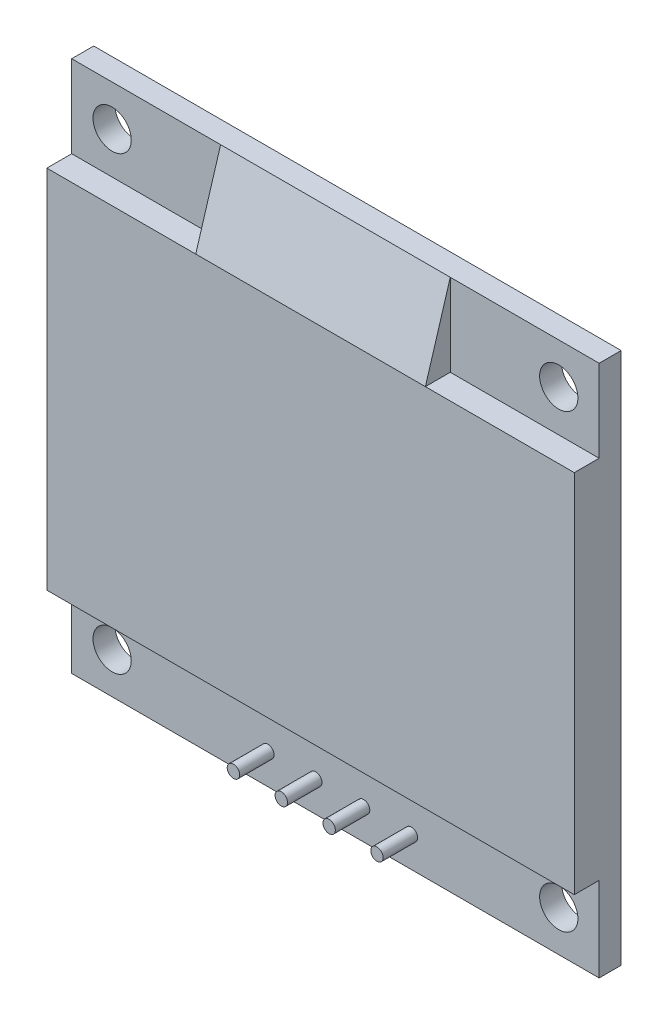
ISO-10303-21;
HEADER;
FILE_DESCRIPTION(('STEP AP214'),'2;1');
FILE_NAME('part.step','',(''),(''),'','','');
FILE_SCHEMA(('AUTOMOTIVE_DESIGN { 1 0 10303 214 1 1 1 1 }'));
ENDSEC;
DATA;
#1=APPLICATION_CONTEXT('core data for automotive mechanical design processes');
#2=APPLICATION_PROTOCOL_DEFINITION('international standard','automotive_design',2000,#1);
#3=PRODUCT_CONTEXT('',#1,'mechanical');
#4=PRODUCT('Part','Part','',(#3));
#5=PRODUCT_RELATED_PRODUCT_CATEGORY('part','',(#4));
#6=PRODUCT_DEFINITION_FORMATION('','',#4);
#7=PRODUCT_DEFINITION_CONTEXT('part definition',#1,'design');
#8=PRODUCT_DEFINITION('design','',#6,#7);
#9=PRODUCT_DEFINITION_SHAPE('','',#8);
#10=(LENGTH_UNIT() NAMED_UNIT(*) SI_UNIT(.MILLI.,.METRE.));
#11=(NAMED_UNIT(*) PLANE_ANGLE_UNIT() SI_UNIT($,.RADIAN.));
#12=(NAMED_UNIT(*) SI_UNIT($,.STERADIAN.) SOLID_ANGLE_UNIT());
#13=UNCERTAINTY_MEASURE_WITH_UNIT(LENGTH_MEASURE(1.E-05),#10,'distance_accuracy_value','');
#14=(GEOMETRIC_REPRESENTATION_CONTEXT(3) GLOBAL_UNCERTAINTY_ASSIGNED_CONTEXT((#13)) GLOBAL_UNIT_ASSIGNED_CONTEXT((#10,
#11,#12)) REPRESENTATION_CONTEXT('',''));
#15=CARTESIAN_POINT('',(0.,0.,0.));
#16=DIRECTION('',(0.,0.,1.));
#17=DIRECTION('',(1.,0.,0.));
#18=AXIS2_PLACEMENT_3D('',#15,#16,#17);
#19=CARTESIAN_POINT('',(13.78,-13.91,1.15));
#20=DIRECTION('',(0.,0.,1.));
#21=DIRECTION('',(1.,0.,0.));
#22=AXIS2_PLACEMENT_3D('',#19,#20,#21);
#23=PLANE('',#22);
#24=CARTESIAN_POINT('',(-11.6686621752588,11.7787438938933,1.15));
#25=DIRECTION('',(0.,0.,1.));
#26=DIRECTION('',(1.,0.,0.));
#27=AXIS2_PLACEMENT_3D('',#24,#25,#26);
#28=CIRCLE('',#27,1.);
#29=CARTESIAN_POINT('',(-10.6686621752588,11.7787438938933,1.15));
#30=VERTEX_POINT('',#29);
#31=EDGE_CURVE('E239',#30,#30,#28,.T.);
#32=ORIENTED_EDGE('',*,*,#31,.F.);
#33=EDGE_LOOP('',(#32));
#34=FACE_BOUND('',#33,.T.);
#35=DIRECTION('',(-1.,0.,0.));
#36=VECTOR('',#35,1.);
#37=CARTESIAN_POINT('',(-13.78,9.61,1.15));
#38=LINE('',#37,#36);
#39=CARTESIAN_POINT('',(-6.,9.61,1.15));
#40=VERTEX_POINT('',#39);
#41=CARTESIAN_POINT('',(-13.78,9.61,1.15));
#42=VERTEX_POINT('',#41);
#43=EDGE_CURVE('E36',#40,#42,#38,.T.);
#44=ORIENTED_EDGE('',*,*,#43,.F.);
#45=DIRECTION('',(0.,1.,0.));
#46=VECTOR('',#45,1.);
#47=CARTESIAN_POINT('',(-6.,13.91,1.15));
#48=LINE('',#47,#46);
#49=CARTESIAN_POINT('',(-6.,13.91,1.15));
#50=VERTEX_POINT('',#49);
#51=EDGE_CURVE('E415',#40,#50,#48,.T.);
#52=ORIENTED_EDGE('',*,*,#51,.T.);
#53=DIRECTION('',(-1.,0.,0.));
#54=VECTOR('',#53,1.);
#55=CARTESIAN_POINT('',(-13.78,13.91,1.15));
#56=LINE('',#55,#54);
#57=CARTESIAN_POINT('',(-13.78,13.91,1.15));
#58=VERTEX_POINT('',#57);
#59=EDGE_CURVE('E193',#50,#58,#56,.T.);
#60=ORIENTED_EDGE('',*,*,#59,.T.);
#61=DIRECTION('',(0.,-1.,0.));
#62=VECTOR('',#61,1.);
#63=CARTESIAN_POINT('',(-13.78,13.91,1.15));
#64=LINE('',#63,#62);
#65=EDGE_CURVE('E202',#58,#42,#64,.T.);
#66=ORIENTED_EDGE('',*,*,#65,.T.);
#67=EDGE_LOOP('',(#44,#52,#60,#66));
#68=FACE_BOUND('',#67,.T.);
#69=ADVANCED_FACE('F32',(#34,#68),#23,.T.);
#70=CARTESIAN_POINT('',(-13.78,9.61,2.45));
#71=DIRECTION('',(0.,-1.,0.));
#72=DIRECTION('',(0.,0.,-1.));
#73=AXIS2_PLACEMENT_3D('',#70,#71,#72);
#74=PLANE('',#73);
#75=DIRECTION('',(0.,0.,-1.));
#76=VECTOR('',#75,1.);
#77=CARTESIAN_POINT('',(-6.,9.61,2.45));
#78=LINE('',#77,#76);
#79=CARTESIAN_POINT('',(-6.,9.61,2.45));
#80=VERTEX_POINT('',#79);
#81=EDGE_CURVE('E50',#80,#40,#78,.T.);
#82=ORIENTED_EDGE('',*,*,#81,.T.);
#83=ORIENTED_EDGE('',*,*,#43,.T.);
#84=DIRECTION('',(0.,0.,-1.));
#85=VECTOR('',#84,1.);
#86=CARTESIAN_POINT('',(-13.78,9.61,2.45));
#87=LINE('',#86,#85);
#88=CARTESIAN_POINT('',(-13.78,9.61,2.45));
#89=VERTEX_POINT('',#88);
#90=EDGE_CURVE('E279',#89,#42,#87,.T.);
#91=ORIENTED_EDGE('',*,*,#90,.F.);
#92=DIRECTION('',(-1.,0.,0.));
#93=VECTOR('',#92,1.);
#94=CARTESIAN_POINT('',(-13.78,9.61,2.45));
#95=LINE('',#94,#93);
#96=EDGE_CURVE('E379',#80,#89,#95,.T.);
#97=ORIENTED_EDGE('',*,*,#96,.F.);
#98=EDGE_LOOP('',(#82,#83,#91,#97));
#99=FACE_BOUND('',#98,.T.);
#100=ADVANCED_FACE('F389',(#99),#74,.F.);
#101=CARTESIAN_POINT('',(13.78,-13.91,0.));
#102=DIRECTION('',(0.,0.,1.));
#103=DIRECTION('',(1.,0.,0.));
#104=AXIS2_PLACEMENT_3D('',#101,#102,#103);
#105=PLANE('',#104);
#106=DIRECTION('',(0.,-1.,0.));
#107=VECTOR('',#106,1.);
#108=CARTESIAN_POINT('',(-1.04831699451324,-6.30826839928922,0.));
#109=LINE('',#108,#107);
#110=CARTESIAN_POINT('',(-1.04831699451324,-6.30826839928922,0.));
#111=VERTEX_POINT('',#110);
#112=CARTESIAN_POINT('',(-1.04831699451324,-8.00932513918795,0.));
#113=VERTEX_POINT('',#112);
#114=EDGE_CURVE('E337',#111,#113,#109,.T.);
#115=ORIENTED_EDGE('',*,*,#114,.F.);
#116=DIRECTION('',(1.,0.,0.));
#117=VECTOR('',#116,1.);
#118=CARTESIAN_POINT('',(-1.04831699451324,-6.30826839928922,0.));
#119=LINE('',#118,#117);
#120=CARTESIAN_POINT('',(-7.56600407436281,-6.30826839928922,0.));
#121=VERTEX_POINT('',#120);
#122=EDGE_CURVE('E330',#121,#111,#119,.T.);
#123=ORIENTED_EDGE('',*,*,#122,.F.);
#124=DIRECTION('',(0.,1.,0.));
#125=VECTOR('',#124,1.);
#126=CARTESIAN_POINT('',(-7.56600407436281,-6.30826839928922,0.));
#127=LINE('',#126,#125);
#128=CARTESIAN_POINT('',(-7.56600407436281,-8.00932513918795,0.));
#129=VERTEX_POINT('',#128);
#130=EDGE_CURVE('E343',#129,#121,#127,.T.);
#131=ORIENTED_EDGE('',*,*,#130,.F.);
#132=DIRECTION('',(-1.,0.,0.));
#133=VECTOR('',#132,1.);
#134=CARTESIAN_POINT('',(-1.04831699451324,-8.00932513918795,0.));
#135=LINE('',#134,#133);
#136=EDGE_CURVE('E340',#113,#129,#135,.T.);
#137=ORIENTED_EDGE('',*,*,#136,.F.);
#138=EDGE_LOOP('',(#115,#123,#131,#137));
#139=FACE_BOUND('',#138,.T.);
#140=CARTESIAN_POINT('',(-11.6686621752588,-11.7787438938933,0.));
#141=DIRECTION('',(0.,0.,1.));
#142=DIRECTION('',(1.,0.,0.));
#143=AXIS2_PLACEMENT_3D('',#140,#141,#142);
#144=CIRCLE('',#143,1.);
#145=CARTESIAN_POINT('',(-10.6686621752588,-11.7787438938933,0.));
#146=VERTEX_POINT('',#145);
#147=EDGE_CURVE('E256',#146,#146,#144,.T.);
#148=ORIENTED_EDGE('',*,*,#147,.T.);
#149=EDGE_LOOP('',(#148));
#150=FACE_BOUND('',#149,.T.);
#151=CARTESIAN_POINT('',(-11.6686621752588,11.7787438938933,0.));
#152=DIRECTION('',(0.,0.,1.));
#153=DIRECTION('',(1.,0.,0.));
#154=AXIS2_PLACEMENT_3D('',#151,#152,#153);
#155=CIRCLE('',#154,1.);
#156=CARTESIAN_POINT('',(-10.6686621752588,11.7787438938933,0.));
#157=VERTEX_POINT('',#156);
#158=EDGE_CURVE('E243',#157,#157,#155,.T.);
#159=ORIENTED_EDGE('',*,*,#158,.T.);
#160=EDGE_LOOP('',(#159));
#161=FACE_BOUND('',#160,.T.);
#162=DIRECTION('',(0.,1.,0.));
#163=VECTOR('',#162,1.);
#164=CARTESIAN_POINT('',(13.78,13.91,0.));
#165=LINE('',#164,#163);
#166=CARTESIAN_POINT('',(13.78,-13.91,0.));
#167=VERTEX_POINT('',#166);
#168=CARTESIAN_POINT('',(13.78,13.91,0.));
#169=VERTEX_POINT('',#168);
#170=EDGE_CURVE('E237',#167,#169,#165,.T.);
#171=ORIENTED_EDGE('',*,*,#170,.F.);
#172=DIRECTION('',(1.,0.,0.));
#173=VECTOR('',#172,1.);
#174=CARTESIAN_POINT('',(-13.78,-13.91,0.));
#175=LINE('',#174,#173);
#176=CARTESIAN_POINT('',(-13.78,-13.91,0.));
#177=VERTEX_POINT('',#176);
#178=EDGE_CURVE('E219',#177,#167,#175,.T.);
#179=ORIENTED_EDGE('',*,*,#178,.F.);
#180=DIRECTION('',(0.,-1.,0.));
#181=VECTOR('',#180,1.);
#182=CARTESIAN_POINT('',(-13.78,13.91,0.));
#183=LINE('',#182,#181);
#184=CARTESIAN_POINT('',(-13.78,13.91,0.));
#185=VERTEX_POINT('',#184);
#186=EDGE_CURVE('E234',#185,#177,#183,.T.);
#187=ORIENTED_EDGE('',*,*,#186,.F.);
#188=DIRECTION('',(-1.,0.,0.));
#189=VECTOR('',#188,1.);
#190=CARTESIAN_POINT('',(-13.78,13.91,0.));
#191=LINE('',#190,#189);
#192=EDGE_CURVE('E236',#169,#185,#191,.T.);
#193=ORIENTED_EDGE('',*,*,#192,.F.);
#194=EDGE_LOOP('',(#171,#179,#187,#193));
#195=FACE_BOUND('',#194,.T.);
#196=CARTESIAN_POINT('',(11.6686621752588,11.7787438938933,0.));
#197=DIRECTION('',(0.,0.,1.));
#198=DIRECTION('',(1.,0.,0.));
#199=AXIS2_PLACEMENT_3D('',#196,#197,#198);
#200=CIRCLE('',#199,0.999999999999999);
#201=CARTESIAN_POINT('',(12.6686621752588,11.7787438938933,0.));
#202=VERTEX_POINT('',#201);
#203=EDGE_CURVE('E250',#202,#202,#200,.T.);
#204=ORIENTED_EDGE('',*,*,#203,.T.);
#205=EDGE_LOOP('',(#204));
#206=FACE_BOUND('',#205,.T.);
#207=CARTESIAN_POINT('',(11.6686621752588,-11.7787438938933,0.));
#208=DIRECTION('',(0.,0.,1.));
#209=DIRECTION('',(1.,0.,0.));
#210=AXIS2_PLACEMENT_3D('',#207,#208,#209);
#211=CIRCLE('',#210,1.);
#212=CARTESIAN_POINT('',(12.6686621752588,-11.7787438938933,0.));
#213=VERTEX_POINT('',#212);
#214=EDGE_CURVE('E262',#213,#213,#211,.T.);
#215=ORIENTED_EDGE('',*,*,#214,.T.);
#216=EDGE_LOOP('',(#215));
#217=FACE_BOUND('',#216,.T.);
#218=DIRECTION('',(0.,-1.,0.));
#219=VECTOR('',#218,1.);
#220=CARTESIAN_POINT('',(5.22,-11.06,0.));
#221=LINE('',#220,#219);
#222=CARTESIAN_POINT('',(5.22,-11.06,0.));
#223=VERTEX_POINT('',#222);
#224=CARTESIAN_POINT('',(5.22,-13.56,0.));
#225=VERTEX_POINT('',#224);
#226=EDGE_CURVE('E194',#223,#225,#221,.T.);
#227=ORIENTED_EDGE('',*,*,#226,.F.);
#228=DIRECTION('',(1.,0.,0.));
#229=VECTOR('',#228,1.);
#230=CARTESIAN_POINT('',(5.22,-11.06,0.));
#231=LINE('',#230,#229);
#232=CARTESIAN_POINT('',(-4.78,-11.06,0.));
#233=VERTEX_POINT('',#232);
#234=EDGE_CURVE('E424',#233,#223,#231,.T.);
#235=ORIENTED_EDGE('',*,*,#234,.F.);
#236=DIRECTION('',(0.,1.,0.));
#237=VECTOR('',#236,1.);
#238=CARTESIAN_POINT('',(-4.78,-11.06,0.));
#239=LINE('',#238,#237);
#240=CARTESIAN_POINT('',(-4.78,-13.56,0.));
#241=VERTEX_POINT('',#240);
#242=EDGE_CURVE('E434',#241,#233,#239,.T.);
#243=ORIENTED_EDGE('',*,*,#242,.F.);
#244=DIRECTION('',(-1.,0.,0.));
#245=VECTOR('',#244,1.);
#246=CARTESIAN_POINT('',(5.22,-13.56,0.));
#247=LINE('',#246,#245);
#248=EDGE_CURVE('E58',#225,#241,#247,.T.);
#249=ORIENTED_EDGE('',*,*,#248,.F.);
#250=EDGE_LOOP('',(#227,#235,#243,#249));
#251=FACE_BOUND('',#250,.T.);
#252=ADVANCED_FACE('F455',(#139,#150,#161,#195,#206,#217,#251),#105,.F.);
#253=DIRECTION('',(0.,1.,0.));
#254=VECTOR('',#253,1.);
#255=CARTESIAN_POINT('',(6.,13.91,1.15));
#256=LINE('',#255,#254);
#257=CARTESIAN_POINT('',(6.,9.61,1.15));
#258=VERTEX_POINT('',#257);
#259=CARTESIAN_POINT('',(6.,13.91,1.15));
#260=VERTEX_POINT('',#259);
#261=EDGE_CURVE('E177',#258,#260,#256,.T.);
#262=ORIENTED_EDGE('',*,*,#261,.F.);
#263=CARTESIAN_POINT('',(13.78,9.61,1.15));
#264=VERTEX_POINT('',#263);
#265=EDGE_CURVE('E273',#264,#258,#38,.T.);
#266=ORIENTED_EDGE('',*,*,#265,.F.);
#267=DIRECTION('',(0.,1.,0.));
#268=VECTOR('',#267,1.);
#269=CARTESIAN_POINT('',(13.78,13.91,1.15));
#270=LINE('',#269,#268);
#271=CARTESIAN_POINT('',(13.78,13.91,1.15));
#272=VERTEX_POINT('',#271);
#273=EDGE_CURVE('E199',#264,#272,#270,.T.);
#274=ORIENTED_EDGE('',*,*,#273,.T.);
#275=EDGE_CURVE('E190',#272,#260,#56,.T.);
#276=ORIENTED_EDGE('',*,*,#275,.T.);
#277=EDGE_LOOP('',(#262,#266,#274,#276));
#278=FACE_BOUND('',#277,.T.);
#279=CARTESIAN_POINT('',(11.6686621752588,11.7787438938933,1.15));
#280=DIRECTION('',(0.,0.,1.));
#281=DIRECTION('',(1.,0.,0.));
#282=AXIS2_PLACEMENT_3D('',#279,#280,#281);
#283=CIRCLE('',#282,0.999999999999999);
#284=CARTESIAN_POINT('',(12.6686621752588,11.7787438938933,1.15));
#285=VERTEX_POINT('',#284);
#286=EDGE_CURVE('E248',#285,#285,#283,.T.);
#287=ORIENTED_EDGE('',*,*,#286,.F.);
#288=EDGE_LOOP('',(#287));
#289=FACE_BOUND('',#288,.T.);
#290=ADVANCED_FACE('F196',(#278,#289),#23,.T.);
#291=CARTESIAN_POINT('',(-1.03,-12.31,1.15));
#292=DIRECTION('',(0.,0.,1.));
#293=DIRECTION('',(1.,0.,0.));
#294=AXIS2_PLACEMENT_3D('',#291,#292,#293);
#295=CIRCLE('',#294,0.325);
#296=CARTESIAN_POINT('',(-0.704999999999998,-12.31,1.15));
#297=VERTEX_POINT('',#296);
#298=EDGE_CURVE('E291',#297,#297,#295,.T.);
#299=ORIENTED_EDGE('',*,*,#298,.F.);
#300=EDGE_LOOP('',(#299));
#301=FACE_BOUND('',#300,.T.);
#302=CARTESIAN_POINT('',(-3.53,-12.31,1.15));
#303=DIRECTION('',(0.,0.,1.));
#304=DIRECTION('',(1.,0.,0.));
#305=AXIS2_PLACEMENT_3D('',#302,#303,#304);
#306=CIRCLE('',#305,0.325);
#307=CARTESIAN_POINT('',(-3.205,-12.31,1.15));
#308=VERTEX_POINT('',#307);
#309=EDGE_CURVE('E223',#308,#308,#306,.T.);
#310=ORIENTED_EDGE('',*,*,#309,.F.);
#311=EDGE_LOOP('',(#310));
#312=FACE_BOUND('',#311,.T.);
#313=DIRECTION('',(1.,0.,0.));
#314=VECTOR('',#313,1.);
#315=CARTESIAN_POINT('',(-13.78,-9.49000000000001,1.15));
#316=LINE('',#315,#314);
#317=CARTESIAN_POINT('',(-13.78,-9.48999999999999,1.15));
#318=VERTEX_POINT('',#317);
#319=CARTESIAN_POINT('',(13.78,-9.49000000000001,1.15));
#320=VERTEX_POINT('',#319);
#321=EDGE_CURVE('E371',#318,#320,#316,.T.);
#322=ORIENTED_EDGE('',*,*,#321,.F.);
#323=CARTESIAN_POINT('',(-13.78,-13.91,1.15));
#324=VERTEX_POINT('',#323);
#325=EDGE_CURVE('E200',#318,#324,#64,.T.);
#326=ORIENTED_EDGE('',*,*,#325,.T.);
#327=DIRECTION('',(1.,0.,0.));
#328=VECTOR('',#327,1.);
#329=CARTESIAN_POINT('',(-13.78,-13.91,1.15));
#330=LINE('',#329,#328);
#331=CARTESIAN_POINT('',(13.78,-13.91,1.15));
#332=VERTEX_POINT('',#331);
#333=EDGE_CURVE('E211',#324,#332,#330,.T.);
#334=ORIENTED_EDGE('',*,*,#333,.T.);
#335=EDGE_CURVE('E204',#332,#320,#270,.T.);
#336=ORIENTED_EDGE('',*,*,#335,.T.);
#337=EDGE_LOOP('',(#322,#326,#334,#336));
#338=FACE_BOUND('',#337,.T.);
#339=CARTESIAN_POINT('',(-11.6686621752588,-11.7787438938933,1.15));
#340=DIRECTION('',(0.,0.,1.));
#341=DIRECTION('',(1.,0.,0.));
#342=AXIS2_PLACEMENT_3D('',#339,#340,#341);
#343=CIRCLE('',#342,1.);
#344=CARTESIAN_POINT('',(-10.6686621752588,-11.7787438938933,1.15));
#345=VERTEX_POINT('',#344);
#346=EDGE_CURVE('E253',#345,#345,#343,.T.);
#347=ORIENTED_EDGE('',*,*,#346,.F.);
#348=EDGE_LOOP('',(#347));
#349=FACE_BOUND('',#348,.T.);
#350=CARTESIAN_POINT('',(11.6686621752588,-11.7787438938933,1.15));
#351=DIRECTION('',(0.,0.,1.));
#352=DIRECTION('',(1.,0.,0.));
#353=AXIS2_PLACEMENT_3D('',#350,#351,#352);
#354=CIRCLE('',#353,1.);
#355=CARTESIAN_POINT('',(12.6686621752588,-11.7787438938933,1.15));
#356=VERTEX_POINT('',#355);
#357=EDGE_CURVE('E259',#356,#356,#354,.T.);
#358=ORIENTED_EDGE('',*,*,#357,.F.);
#359=EDGE_LOOP('',(#358));
#360=FACE_BOUND('',#359,.T.);
#361=CARTESIAN_POINT('',(1.47,-12.31,1.15));
#362=DIRECTION('',(0.,0.,1.));
#363=DIRECTION('',(1.,0.,0.));
#364=AXIS2_PLACEMENT_3D('',#361,#362,#363);
#365=CIRCLE('',#364,0.325);
#366=CARTESIAN_POINT('',(1.795,-12.31,1.15));
#367=VERTEX_POINT('',#366);
#368=EDGE_CURVE('E294',#367,#367,#365,.T.);
#369=ORIENTED_EDGE('',*,*,#368,.F.);
#370=EDGE_LOOP('',(#369));
#371=FACE_BOUND('',#370,.T.);
#372=CARTESIAN_POINT('',(3.97,-12.31,1.15));
#373=DIRECTION('',(0.,0.,1.));
#374=DIRECTION('',(1.,0.,0.));
#375=AXIS2_PLACEMENT_3D('',#372,#373,#374);
#376=CIRCLE('',#375,0.325);
#377=CARTESIAN_POINT('',(4.295,-12.31,1.15));
#378=VERTEX_POINT('',#377);
#379=EDGE_CURVE('E300',#378,#378,#376,.T.);
#380=ORIENTED_EDGE('',*,*,#379,.F.);
#381=EDGE_LOOP('',(#380));
#382=FACE_BOUND('',#381,.T.);
#383=ADVANCED_FACE('F478',(#301,#312,#338,#349,#360,#371,#382),#23,.T.);
#384=CARTESIAN_POINT('',(13.78,13.91,1.15));
#385=DIRECTION('',(-1.,0.,0.));
#386=DIRECTION('',(0.,-1.,0.));
#387=AXIS2_PLACEMENT_3D('',#384,#385,#386);
#388=PLANE('',#387);
#389=ORIENTED_EDGE('',*,*,#170,.T.);
#390=DIRECTION('',(0.,0.,-1.));
#391=VECTOR('',#390,1.);
#392=CARTESIAN_POINT('',(13.78,13.91,1.15));
#393=LINE('',#392,#391);
#394=EDGE_CURVE('E221',#272,#169,#393,.T.);
#395=ORIENTED_EDGE('',*,*,#394,.F.);
#396=ORIENTED_EDGE('',*,*,#273,.F.);
#397=DIRECTION('',(0.,0.,-1.));
#398=VECTOR('',#397,1.);
#399=CARTESIAN_POINT('',(13.78,9.61,2.45));
#400=LINE('',#399,#398);
#401=CARTESIAN_POINT('',(13.78,9.61,2.45));
#402=VERTEX_POINT('',#401);
#403=EDGE_CURVE('E282',#402,#264,#400,.T.);
#404=ORIENTED_EDGE('',*,*,#403,.F.);
#405=DIRECTION('',(0.,1.,0.));
#406=VECTOR('',#405,1.);
#407=CARTESIAN_POINT('',(13.78,9.61,2.45));
#408=LINE('',#407,#406);
#409=CARTESIAN_POINT('',(13.78,-9.49000000000001,2.45));
#410=VERTEX_POINT('',#409);
#411=EDGE_CURVE('E378',#410,#402,#408,.T.);
#412=ORIENTED_EDGE('',*,*,#411,.F.);
#413=DIRECTION('',(0.,0.,-1.));
#414=VECTOR('',#413,1.);
#415=CARTESIAN_POINT('',(13.78,-9.49000000000001,2.45));
#416=LINE('',#415,#414);
#417=EDGE_CURVE('E288',#410,#320,#416,.T.);
#418=ORIENTED_EDGE('',*,*,#417,.T.);
#419=ORIENTED_EDGE('',*,*,#335,.F.);
#420=DIRECTION('',(0.,0.,-1.));
#421=VECTOR('',#420,1.);
#422=CARTESIAN_POINT('',(13.78,-13.91,1.15));
#423=LINE('',#422,#421);
#424=EDGE_CURVE('E230',#332,#167,#423,.T.);
#425=ORIENTED_EDGE('',*,*,#424,.T.);
#426=EDGE_LOOP('',(#389,#395,#396,#404,#412,#418,#419,#425));
#427=FACE_BOUND('',#426,.T.);
#428=ADVANCED_FACE('F408',(#427),#388,.F.);
#429=CARTESIAN_POINT('',(-13.78,13.91,1.15));
#430=DIRECTION('',(0.,-1.,0.));
#431=DIRECTION('',(0.,0.,-1.));
#432=AXIS2_PLACEMENT_3D('',#429,#430,#431);
#433=PLANE('',#432);
#434=ORIENTED_EDGE('',*,*,#192,.T.);
#435=DIRECTION('',(0.,0.,-1.));
#436=VECTOR('',#435,1.);
#437=CARTESIAN_POINT('',(-13.78,13.91,1.15));
#438=LINE('',#437,#436);
#439=EDGE_CURVE('E224',#58,#185,#438,.T.);
#440=ORIENTED_EDGE('',*,*,#439,.F.);
#441=ORIENTED_EDGE('',*,*,#59,.F.);
#442=DIRECTION('',(-1.,0.,0.));
#443=VECTOR('',#442,1.);
#444=CARTESIAN_POINT('',(6.,13.91,1.15));
#445=LINE('',#444,#443);
#446=EDGE_CURVE('E170',#260,#50,#445,.T.);
#447=ORIENTED_EDGE('',*,*,#446,.F.);
#448=ORIENTED_EDGE('',*,*,#275,.F.);
#449=ORIENTED_EDGE('',*,*,#394,.T.);
#450=EDGE_LOOP('',(#434,#440,#441,#447,#448,#449));
#451=FACE_BOUND('',#450,.T.);
#452=ADVANCED_FACE('F188',(#451),#433,.F.);
#453=CARTESIAN_POINT('',(-13.78,13.91,1.15));
#454=DIRECTION('',(1.,0.,0.));
#455=DIRECTION('',(0.,1.,0.));
#456=AXIS2_PLACEMENT_3D('',#453,#454,#455);
#457=PLANE('',#456);
#458=ORIENTED_EDGE('',*,*,#186,.T.);
#459=DIRECTION('',(0.,0.,-1.));
#460=VECTOR('',#459,1.);
#461=CARTESIAN_POINT('',(-13.78,-13.91,1.15));
#462=LINE('',#461,#460);
#463=EDGE_CURVE('E227',#324,#177,#462,.T.);
#464=ORIENTED_EDGE('',*,*,#463,.F.);
#465=ORIENTED_EDGE('',*,*,#325,.F.);
#466=DIRECTION('',(0.,0.,-1.));
#467=VECTOR('',#466,1.);
#468=CARTESIAN_POINT('',(-13.78,-9.49000000000001,2.45));
#469=LINE('',#468,#467);
#470=CARTESIAN_POINT('',(-13.78,-9.49000000000001,2.45));
#471=VERTEX_POINT('',#470);
#472=EDGE_CURVE('E265',#471,#318,#469,.T.);
#473=ORIENTED_EDGE('',*,*,#472,.F.);
#474=DIRECTION('',(0.,-1.,0.));
#475=VECTOR('',#474,1.);
#476=CARTESIAN_POINT('',(-13.78,9.61,2.45));
#477=LINE('',#476,#475);
#478=EDGE_CURVE('E276',#89,#471,#477,.T.);
#479=ORIENTED_EDGE('',*,*,#478,.F.);
#480=ORIENTED_EDGE('',*,*,#90,.T.);
#481=ORIENTED_EDGE('',*,*,#65,.F.);
#482=ORIENTED_EDGE('',*,*,#439,.T.);
#483=EDGE_LOOP('',(#458,#464,#465,#473,#479,#480,#481,#482));
#484=FACE_BOUND('',#483,.T.);
#485=ADVANCED_FACE('F393',(#484),#457,.F.);
#486=CARTESIAN_POINT('',(-13.78,-13.91,1.15));
#487=DIRECTION('',(0.,1.,0.));
#488=DIRECTION('',(0.,0.,1.));
#489=AXIS2_PLACEMENT_3D('',#486,#487,#488);
#490=PLANE('',#489);
#491=ORIENTED_EDGE('',*,*,#178,.T.);
#492=ORIENTED_EDGE('',*,*,#424,.F.);
#493=ORIENTED_EDGE('',*,*,#333,.F.);
#494=ORIENTED_EDGE('',*,*,#463,.T.);
#495=EDGE_LOOP('',(#491,#492,#493,#494));
#496=FACE_BOUND('',#495,.T.);
#497=ADVANCED_FACE('F587',(#496),#490,.F.);
#498=CARTESIAN_POINT('',(-11.6686621752588,11.7787438938933,1.15));
#499=DIRECTION('',(0.,0.,-1.));
#500=DIRECTION('',(-1.,0.,0.));
#501=AXIS2_PLACEMENT_3D('',#498,#499,#500);
#502=CYLINDRICAL_SURFACE('',#501,1.);
#503=ORIENTED_EDGE('',*,*,#31,.T.);
#504=EDGE_LOOP('',(#503));
#505=FACE_BOUND('',#504,.T.);
#506=ORIENTED_EDGE('',*,*,#158,.F.);
#507=EDGE_LOOP('',(#506));
#508=FACE_BOUND('',#507,.T.);
#509=ADVANCED_FACE('F584',(#505,#508),#502,.F.);
#510=CARTESIAN_POINT('',(11.6686621752588,11.7787438938933,1.15));
#511=DIRECTION('',(0.,0.,-1.));
#512=DIRECTION('',(-1.,0.,0.));
#513=AXIS2_PLACEMENT_3D('',#510,#511,#512);
#514=CYLINDRICAL_SURFACE('',#513,0.999999999999999);
#515=ORIENTED_EDGE('',*,*,#286,.T.);
#516=EDGE_LOOP('',(#515));
#517=FACE_BOUND('',#516,.T.);
#518=ORIENTED_EDGE('',*,*,#203,.F.);
#519=EDGE_LOOP('',(#518));
#520=FACE_BOUND('',#519,.T.);
#521=ADVANCED_FACE('F581',(#517,#520),#514,.F.);
#522=CARTESIAN_POINT('',(-11.6686621752588,-11.7787438938933,1.15));
#523=DIRECTION('',(0.,0.,-1.));
#524=DIRECTION('',(-1.,0.,0.));
#525=AXIS2_PLACEMENT_3D('',#522,#523,#524);
#526=CYLINDRICAL_SURFACE('',#525,1.);
#527=ORIENTED_EDGE('',*,*,#346,.T.);
#528=EDGE_LOOP('',(#527));
#529=FACE_BOUND('',#528,.T.);
#530=ORIENTED_EDGE('',*,*,#147,.F.);
#531=EDGE_LOOP('',(#530));
#532=FACE_BOUND('',#531,.T.);
#533=ADVANCED_FACE('F577',(#529,#532),#526,.F.);
#534=CARTESIAN_POINT('',(11.6686621752588,-11.7787438938933,1.15));
#535=DIRECTION('',(0.,0.,-1.));
#536=DIRECTION('',(-1.,0.,0.));
#537=AXIS2_PLACEMENT_3D('',#534,#535,#536);
#538=CYLINDRICAL_SURFACE('',#537,1.);
#539=ORIENTED_EDGE('',*,*,#357,.T.);
#540=EDGE_LOOP('',(#539));
#541=FACE_BOUND('',#540,.T.);
#542=ORIENTED_EDGE('',*,*,#214,.F.);
#543=EDGE_LOOP('',(#542));
#544=FACE_BOUND('',#543,.T.);
#545=ADVANCED_FACE('F574',(#541,#544),#538,.F.);
#546=CARTESIAN_POINT('',(-13.78,-9.49000000000001,2.45));
#547=DIRECTION('',(0.,1.,0.));
#548=DIRECTION('',(0.,0.,1.));
#549=AXIS2_PLACEMENT_3D('',#546,#547,#548);
#550=PLANE('',#549);
#551=ORIENTED_EDGE('',*,*,#321,.T.);
#552=ORIENTED_EDGE('',*,*,#417,.F.);
#553=DIRECTION('',(1.,0.,0.));
#554=VECTOR('',#553,1.);
#555=CARTESIAN_POINT('',(-13.78,-9.49000000000001,2.45));
#556=LINE('',#555,#554);
#557=EDGE_CURVE('E376',#471,#410,#556,.T.);
#558=ORIENTED_EDGE('',*,*,#557,.F.);
#559=ORIENTED_EDGE('',*,*,#472,.T.);
#560=EDGE_LOOP('',(#551,#552,#558,#559));
#561=FACE_BOUND('',#560,.T.);
#562=ADVANCED_FACE('F404',(#561),#550,.F.);
#563=ORIENTED_EDGE('',*,*,#265,.T.);
#564=DIRECTION('',(0.,0.,-1.));
#565=VECTOR('',#564,1.);
#566=CARTESIAN_POINT('',(6.,9.61,2.45));
#567=LINE('',#566,#565);
#568=CARTESIAN_POINT('',(6.,9.61,2.45));
#569=VERTEX_POINT('',#568);
#570=EDGE_CURVE('E176',#569,#258,#567,.T.);
#571=ORIENTED_EDGE('',*,*,#570,.F.);
#572=EDGE_CURVE('E283',#402,#569,#95,.T.);
#573=ORIENTED_EDGE('',*,*,#572,.F.);
#574=ORIENTED_EDGE('',*,*,#403,.T.);
#575=EDGE_LOOP('',(#563,#571,#573,#574));
#576=FACE_BOUND('',#575,.T.);
#577=ADVANCED_FACE('F411',(#576),#74,.F.);
#578=CARTESIAN_POINT('',(-13.78,-9.49000000000001,2.45));
#579=DIRECTION('',(0.,0.,1.));
#580=DIRECTION('',(1.,0.,0.));
#581=AXIS2_PLACEMENT_3D('',#578,#579,#580);
#582=PLANE('',#581);
#583=ORIENTED_EDGE('',*,*,#478,.T.);
#584=ORIENTED_EDGE('',*,*,#557,.T.);
#585=ORIENTED_EDGE('',*,*,#411,.T.);
#586=ORIENTED_EDGE('',*,*,#572,.T.);
#587=DIRECTION('',(-1.,0.,0.));
#588=VECTOR('',#587,1.);
#589=CARTESIAN_POINT('',(6.,9.61,2.45));
#590=LINE('',#589,#588);
#591=EDGE_CURVE('E173',#569,#80,#590,.T.);
#592=ORIENTED_EDGE('',*,*,#591,.T.);
#593=ORIENTED_EDGE('',*,*,#96,.T.);
#594=EDGE_LOOP('',(#583,#584,#585,#586,#592,#593));
#595=FACE_BOUND('',#594,.T.);
#596=ADVANCED_FACE('F385',(#595),#582,.T.);
#597=CARTESIAN_POINT('',(-3.53,-12.31,-8.95));
#598=DIRECTION('',(0.,0.,1.));
#599=DIRECTION('',(1.,0.,0.));
#600=AXIS2_PLACEMENT_3D('',#597,#598,#599);
#601=CYLINDRICAL_SURFACE('',#600,0.325);
#602=ORIENTED_EDGE('',*,*,#309,.T.);
#603=EDGE_LOOP('',(#602));
#604=FACE_BOUND('',#603,.T.);
#605=CARTESIAN_POINT('',(-3.53,-12.31,2.95));
#606=DIRECTION('',(0.,0.,1.));
#607=DIRECTION('',(1.,0.,0.));
#608=AXIS2_PLACEMENT_3D('',#605,#606,#607);
#609=CIRCLE('',#608,0.325);
#610=CARTESIAN_POINT('',(-3.205,-12.31,2.95));
#611=VERTEX_POINT('',#610);
#612=EDGE_CURVE('E365',#611,#611,#609,.T.);
#613=ORIENTED_EDGE('',*,*,#612,.F.);
#614=EDGE_LOOP('',(#613));
#615=FACE_BOUND('',#614,.T.);
#616=ADVANCED_FACE('F560',(#604,#615),#601,.T.);
#617=CARTESIAN_POINT('',(-3.53,-12.31,2.95));
#618=DIRECTION('',(0.,0.,1.));
#619=DIRECTION('',(1.,0.,0.));
#620=AXIS2_PLACEMENT_3D('',#617,#618,#619);
#621=PLANE('',#620);
#622=ORIENTED_EDGE('',*,*,#612,.T.);
#623=EDGE_LOOP('',(#622));
#624=FACE_BOUND('',#623,.T.);
#625=ADVANCED_FACE('F556',(#624),#621,.T.);
#626=CARTESIAN_POINT('',(-1.03,-12.31,-8.95));
#627=DIRECTION('',(0.,0.,1.));
#628=DIRECTION('',(1.,0.,0.));
#629=AXIS2_PLACEMENT_3D('',#626,#627,#628);
#630=CYLINDRICAL_SURFACE('',#629,0.325);
#631=ORIENTED_EDGE('',*,*,#298,.T.);
#632=EDGE_LOOP('',(#631));
#633=FACE_BOUND('',#632,.T.);
#634=CARTESIAN_POINT('',(-1.03,-12.31,2.95));
#635=DIRECTION('',(0.,0.,1.));
#636=DIRECTION('',(1.,0.,0.));
#637=AXIS2_PLACEMENT_3D('',#634,#635,#636);
#638=CIRCLE('',#637,0.325);
#639=CARTESIAN_POINT('',(-0.704999999999998,-12.31,2.95));
#640=VERTEX_POINT('',#639);
#641=EDGE_CURVE('E362',#640,#640,#638,.T.);
#642=ORIENTED_EDGE('',*,*,#641,.F.);
#643=EDGE_LOOP('',(#642));
#644=FACE_BOUND('',#643,.T.);
#645=ADVANCED_FACE('F552',(#633,#644),#630,.T.);
#646=CARTESIAN_POINT('',(-1.03,-12.31,2.95));
#647=DIRECTION('',(0.,0.,1.));
#648=DIRECTION('',(1.,0.,0.));
#649=AXIS2_PLACEMENT_3D('',#646,#647,#648);
#650=PLANE('',#649);
#651=ORIENTED_EDGE('',*,*,#641,.T.);
#652=EDGE_LOOP('',(#651));
#653=FACE_BOUND('',#652,.T.);
#654=ADVANCED_FACE('F549',(#653),#650,.T.);
#655=CARTESIAN_POINT('',(1.47,-12.31,2.95));
#656=DIRECTION('',(0.,0.,1.));
#657=DIRECTION('',(1.,0.,0.));
#658=AXIS2_PLACEMENT_3D('',#655,#656,#657);
#659=PLANE('',#658);
#660=CARTESIAN_POINT('',(1.47,-12.31,2.95));
#661=DIRECTION('',(0.,0.,1.));
#662=DIRECTION('',(1.,0.,0.));
#663=AXIS2_PLACEMENT_3D('',#660,#661,#662);
#664=CIRCLE('',#663,0.325);
#665=CARTESIAN_POINT('',(1.795,-12.31,2.95));
#666=VERTEX_POINT('',#665);
#667=EDGE_CURVE('E297',#666,#666,#664,.T.);
#668=ORIENTED_EDGE('',*,*,#667,.T.);
#669=EDGE_LOOP('',(#668));
#670=FACE_BOUND('',#669,.T.);
#671=ADVANCED_FACE('F519',(#670),#659,.T.);
#672=CARTESIAN_POINT('',(1.47,-12.31,-8.95));
#673=DIRECTION('',(0.,0.,1.));
#674=DIRECTION('',(1.,0.,0.));
#675=AXIS2_PLACEMENT_3D('',#672,#673,#674);
#676=CYLINDRICAL_SURFACE('',#675,0.325);
#677=ORIENTED_EDGE('',*,*,#368,.T.);
#678=EDGE_LOOP('',(#677));
#679=FACE_BOUND('',#678,.T.);
#680=ORIENTED_EDGE('',*,*,#667,.F.);
#681=EDGE_LOOP('',(#680));
#682=FACE_BOUND('',#681,.T.);
#683=ADVANCED_FACE('F514',(#679,#682),#676,.T.);
#684=CARTESIAN_POINT('',(3.97,-12.31,2.95));
#685=DIRECTION('',(0.,0.,1.));
#686=DIRECTION('',(1.,0.,0.));
#687=AXIS2_PLACEMENT_3D('',#684,#685,#686);
#688=PLANE('',#687);
#689=CARTESIAN_POINT('',(3.97,-12.31,2.95));
#690=DIRECTION('',(0.,0.,1.));
#691=DIRECTION('',(1.,0.,0.));
#692=AXIS2_PLACEMENT_3D('',#689,#690,#691);
#693=CIRCLE('',#692,0.325);
#694=CARTESIAN_POINT('',(4.295,-12.31,2.95));
#695=VERTEX_POINT('',#694);
#696=EDGE_CURVE('E303',#695,#695,#693,.T.);
#697=ORIENTED_EDGE('',*,*,#696,.T.);
#698=EDGE_LOOP('',(#697));
#699=FACE_BOUND('',#698,.T.);
#700=ADVANCED_FACE('F509',(#699),#688,.T.);
#701=CARTESIAN_POINT('',(3.97,-12.31,-8.95));
#702=DIRECTION('',(0.,0.,1.));
#703=DIRECTION('',(1.,0.,0.));
#704=AXIS2_PLACEMENT_3D('',#701,#702,#703);
#705=CYLINDRICAL_SURFACE('',#704,0.325);
#706=ORIENTED_EDGE('',*,*,#379,.T.);
#707=EDGE_LOOP('',(#706));
#708=FACE_BOUND('',#707,.T.);
#709=ORIENTED_EDGE('',*,*,#696,.F.);
#710=EDGE_LOOP('',(#709));
#711=FACE_BOUND('',#710,.T.);
#712=ADVANCED_FACE('F505',(#708,#711),#705,.T.);
#713=CARTESIAN_POINT('',(-1.04831699451324,-6.30826839928922,-0.5));
#714=DIRECTION('',(-1.,0.,0.));
#715=DIRECTION('',(0.,0.,1.));
#716=AXIS2_PLACEMENT_3D('',#713,#714,#715);
#717=PLANE('',#716);
#718=ORIENTED_EDGE('',*,*,#114,.T.);
#719=DIRECTION('',(0.,0.,1.));
#720=VECTOR('',#719,1.);
#721=CARTESIAN_POINT('',(-1.04831699451324,-8.00932513918795,-0.5));
#722=LINE('',#721,#720);
#723=CARTESIAN_POINT('',(-1.04831699451324,-8.00932513918795,-0.5));
#724=VERTEX_POINT('',#723);
#725=EDGE_CURVE('E356',#724,#113,#722,.T.);
#726=ORIENTED_EDGE('',*,*,#725,.F.);
#727=DIRECTION('',(0.,-1.,0.));
#728=VECTOR('',#727,1.);
#729=CARTESIAN_POINT('',(-1.04831699451324,-6.30826839928922,-0.5));
#730=LINE('',#729,#728);
#731=CARTESIAN_POINT('',(-1.04831699451324,-6.30826839928922,-0.5));
#732=VERTEX_POINT('',#731);
#733=EDGE_CURVE('E326',#732,#724,#730,.T.);
#734=ORIENTED_EDGE('',*,*,#733,.F.);
#735=DIRECTION('',(0.,0.,1.));
#736=VECTOR('',#735,1.);
#737=CARTESIAN_POINT('',(-1.04831699451324,-6.30826839928922,-0.5));
#738=LINE('',#737,#736);
#739=EDGE_CURVE('E336',#732,#111,#738,.T.);
#740=ORIENTED_EDGE('',*,*,#739,.T.);
#741=EDGE_LOOP('',(#718,#726,#734,#740));
#742=FACE_BOUND('',#741,.T.);
#743=ADVANCED_FACE('F508',(#742),#717,.F.);
#744=CARTESIAN_POINT('',(-1.04831699451324,-8.00932513918795,-0.5));
#745=DIRECTION('',(0.,1.,0.));
#746=DIRECTION('',(0.,0.,1.));
#747=AXIS2_PLACEMENT_3D('',#744,#745,#746);
#748=PLANE('',#747);
#749=ORIENTED_EDGE('',*,*,#136,.T.);
#750=DIRECTION('',(0.,0.,1.));
#751=VECTOR('',#750,1.);
#752=CARTESIAN_POINT('',(-7.56600407436281,-8.00932513918795,-0.5));
#753=LINE('',#752,#751);
#754=CARTESIAN_POINT('',(-7.56600407436281,-8.00932513918795,-0.5));
#755=VERTEX_POINT('',#754);
#756=EDGE_CURVE('E353',#755,#129,#753,.T.);
#757=ORIENTED_EDGE('',*,*,#756,.F.);
#758=DIRECTION('',(-1.,0.,0.));
#759=VECTOR('',#758,1.);
#760=CARTESIAN_POINT('',(-1.04831699451324,-8.00932513918795,-0.5));
#761=LINE('',#760,#759);
#762=EDGE_CURVE('E329',#724,#755,#761,.T.);
#763=ORIENTED_EDGE('',*,*,#762,.F.);
#764=ORIENTED_EDGE('',*,*,#725,.T.);
#765=EDGE_LOOP('',(#749,#757,#763,#764));
#766=FACE_BOUND('',#765,.T.);
#767=ADVANCED_FACE('F720',(#766),#748,.F.);
#768=CARTESIAN_POINT('',(-7.56600407436281,-6.30826839928922,-0.5));
#769=DIRECTION('',(1.,0.,0.));
#770=DIRECTION('',(0.,0.,-1.));
#771=AXIS2_PLACEMENT_3D('',#768,#769,#770);
#772=PLANE('',#771);
#773=ORIENTED_EDGE('',*,*,#130,.T.);
#774=DIRECTION('',(0.,0.,1.));
#775=VECTOR('',#774,1.);
#776=CARTESIAN_POINT('',(-7.56600407436281,-6.30826839928922,-0.5));
#777=LINE('',#776,#775);
#778=CARTESIAN_POINT('',(-7.56600407436281,-6.30826839928922,-0.5));
#779=VERTEX_POINT('',#778);
#780=EDGE_CURVE('E350',#779,#121,#777,.T.);
#781=ORIENTED_EDGE('',*,*,#780,.F.);
#782=DIRECTION('',(0.,1.,0.));
#783=VECTOR('',#782,1.);
#784=CARTESIAN_POINT('',(-7.56600407436281,-6.30826839928922,-0.5));
#785=LINE('',#784,#783);
#786=EDGE_CURVE('E332',#755,#779,#785,.T.);
#787=ORIENTED_EDGE('',*,*,#786,.F.);
#788=ORIENTED_EDGE('',*,*,#756,.T.);
#789=EDGE_LOOP('',(#773,#781,#787,#788));
#790=FACE_BOUND('',#789,.T.);
#791=ADVANCED_FACE('F710',(#790),#772,.F.);
#792=CARTESIAN_POINT('',(-1.04831699451324,-6.30826839928922,-0.5));
#793=DIRECTION('',(0.,-1.,0.));
#794=DIRECTION('',(0.,0.,-1.));
#795=AXIS2_PLACEMENT_3D('',#792,#793,#794);
#796=PLANE('',#795);
#797=ORIENTED_EDGE('',*,*,#122,.T.);
#798=ORIENTED_EDGE('',*,*,#739,.F.);
#799=DIRECTION('',(1.,0.,0.));
#800=VECTOR('',#799,1.);
#801=CARTESIAN_POINT('',(-1.04831699451324,-6.30826839928922,-0.5));
#802=LINE('',#801,#800);
#803=EDGE_CURVE('E334',#779,#732,#802,.T.);
#804=ORIENTED_EDGE('',*,*,#803,.F.);
#805=ORIENTED_EDGE('',*,*,#780,.T.);
#806=EDGE_LOOP('',(#797,#798,#804,#805));
#807=FACE_BOUND('',#806,.T.);
#808=ADVANCED_FACE('F700',(#807),#796,.F.);
#809=CARTESIAN_POINT('',(-1.04831699451324,-8.00932513918795,-0.5));
#810=DIRECTION('',(0.,0.,-1.));
#811=DIRECTION('',(-1.,0.,0.));
#812=AXIS2_PLACEMENT_3D('',#809,#810,#811);
#813=PLANE('',#812);
#814=ORIENTED_EDGE('',*,*,#733,.T.);
#815=ORIENTED_EDGE('',*,*,#762,.T.);
#816=ORIENTED_EDGE('',*,*,#786,.T.);
#817=ORIENTED_EDGE('',*,*,#803,.T.);
#818=EDGE_LOOP('',(#814,#815,#816,#817));
#819=FACE_BOUND('',#818,.T.);
#820=ADVANCED_FACE('F685',(#819),#813,.T.);
#821=CARTESIAN_POINT('',(5.22,-11.06,-2.3));
#822=DIRECTION('',(-1.,0.,0.));
#823=DIRECTION('',(0.,0.,1.));
#824=AXIS2_PLACEMENT_3D('',#821,#822,#823);
#825=PLANE('',#824);
#826=ORIENTED_EDGE('',*,*,#226,.T.);
#827=DIRECTION('',(0.,0.,1.));
#828=VECTOR('',#827,1.);
#829=CARTESIAN_POINT('',(5.22,-13.56,-2.3));
#830=LINE('',#829,#828);
#831=CARTESIAN_POINT('',(5.22,-13.56,-2.3));
#832=VERTEX_POINT('',#831);
#833=EDGE_CURVE('E323',#832,#225,#830,.T.);
#834=ORIENTED_EDGE('',*,*,#833,.F.);
#835=DIRECTION('',(0.,-1.,0.));
#836=VECTOR('',#835,1.);
#837=CARTESIAN_POINT('',(5.22,-11.06,-2.3));
#838=LINE('',#837,#836);
#839=CARTESIAN_POINT('',(5.22,-11.06,-2.3));
#840=VERTEX_POINT('',#839);
#841=EDGE_CURVE('E420',#840,#832,#838,.T.);
#842=ORIENTED_EDGE('',*,*,#841,.F.);
#843=DIRECTION('',(0.,0.,1.));
#844=VECTOR('',#843,1.);
#845=CARTESIAN_POINT('',(5.22,-11.06,-2.3));
#846=LINE('',#845,#844);
#847=EDGE_CURVE('E430',#840,#223,#846,.T.);
#848=ORIENTED_EDGE('',*,*,#847,.T.);
#849=EDGE_LOOP('',(#826,#834,#842,#848));
#850=FACE_BOUND('',#849,.T.);
#851=ADVANCED_FACE('F453',(#850),#825,.F.);
#852=CARTESIAN_POINT('',(5.22,-13.56,-2.3));
#853=DIRECTION('',(0.,1.,0.));
#854=DIRECTION('',(0.,0.,1.));
#855=AXIS2_PLACEMENT_3D('',#852,#853,#854);
#856=PLANE('',#855);
#857=ORIENTED_EDGE('',*,*,#248,.T.);
#858=DIRECTION('',(0.,0.,1.));
#859=VECTOR('',#858,1.);
#860=CARTESIAN_POINT('',(-4.78,-13.56,-2.3));
#861=LINE('',#860,#859);
#862=CARTESIAN_POINT('',(-4.78,-13.56,-2.3));
#863=VERTEX_POINT('',#862);
#864=EDGE_CURVE('E443',#863,#241,#861,.T.);
#865=ORIENTED_EDGE('',*,*,#864,.F.);
#866=DIRECTION('',(-1.,0.,0.));
#867=VECTOR('',#866,1.);
#868=CARTESIAN_POINT('',(5.22,-13.56,-2.3));
#869=LINE('',#868,#867);
#870=EDGE_CURVE('E423',#832,#863,#869,.T.);
#871=ORIENTED_EDGE('',*,*,#870,.F.);
#872=ORIENTED_EDGE('',*,*,#833,.T.);
#873=EDGE_LOOP('',(#857,#865,#871,#872));
#874=FACE_BOUND('',#873,.T.);
#875=ADVANCED_FACE('F450',(#874),#856,.F.);
#876=CARTESIAN_POINT('',(-4.78,-11.06,-2.3));
#877=DIRECTION('',(1.,0.,0.));
#878=DIRECTION('',(0.,0.,-1.));
#879=AXIS2_PLACEMENT_3D('',#876,#877,#878);
#880=PLANE('',#879);
#881=ORIENTED_EDGE('',*,*,#242,.T.);
#882=DIRECTION('',(0.,0.,1.));
#883=VECTOR('',#882,1.);
#884=CARTESIAN_POINT('',(-4.78,-11.06,-2.3));
#885=LINE('',#884,#883);
#886=CARTESIAN_POINT('',(-4.78,-11.06,-2.3));
#887=VERTEX_POINT('',#886);
#888=EDGE_CURVE('E441',#887,#233,#885,.T.);
#889=ORIENTED_EDGE('',*,*,#888,.F.);
#890=DIRECTION('',(0.,1.,0.));
#891=VECTOR('',#890,1.);
#892=CARTESIAN_POINT('',(-4.78,-11.06,-2.3));
#893=LINE('',#892,#891);
#894=EDGE_CURVE('E426',#863,#887,#893,.T.);
#895=ORIENTED_EDGE('',*,*,#894,.F.);
#896=ORIENTED_EDGE('',*,*,#864,.T.);
#897=EDGE_LOOP('',(#881,#889,#895,#896));
#898=FACE_BOUND('',#897,.T.);
#899=ADVANCED_FACE('F460',(#898),#880,.F.);
#900=CARTESIAN_POINT('',(5.22,-11.06,-2.3));
#901=DIRECTION('',(0.,-1.,0.));
#902=DIRECTION('',(0.,0.,-1.));
#903=AXIS2_PLACEMENT_3D('',#900,#901,#902);
#904=PLANE('',#903);
#905=ORIENTED_EDGE('',*,*,#234,.T.);
#906=ORIENTED_EDGE('',*,*,#847,.F.);
#907=DIRECTION('',(1.,0.,0.));
#908=VECTOR('',#907,1.);
#909=CARTESIAN_POINT('',(5.22,-11.06,-2.3));
#910=LINE('',#909,#908);
#911=EDGE_CURVE('E428',#887,#840,#910,.T.);
#912=ORIENTED_EDGE('',*,*,#911,.F.);
#913=ORIENTED_EDGE('',*,*,#888,.T.);
#914=EDGE_LOOP('',(#905,#906,#912,#913));
#915=FACE_BOUND('',#914,.T.);
#916=ADVANCED_FACE('F457',(#915),#904,.F.);
#917=CARTESIAN_POINT('',(5.22,-13.56,-2.3));
#918=DIRECTION('',(0.,0.,-1.));
#919=DIRECTION('',(-1.,0.,0.));
#920=AXIS2_PLACEMENT_3D('',#917,#918,#919);
#921=PLANE('',#920);
#922=CARTESIAN_POINT('',(-3.53,-12.31,-2.3));
#923=DIRECTION('',(0.,0.,-1.));
#924=DIRECTION('',(-1.,0.,0.));
#925=AXIS2_PLACEMENT_3D('',#922,#923,#924);
#926=CIRCLE('',#925,0.325);
#927=CARTESIAN_POINT('',(-3.855,-12.31,-2.3));
#928=VERTEX_POINT('',#927);
#929=EDGE_CURVE('E11',#928,#928,#926,.F.);
#930=ORIENTED_EDGE('',*,*,#929,.T.);
#931=EDGE_LOOP('',(#930));
#932=FACE_BOUND('',#931,.T.);
#933=CARTESIAN_POINT('',(-1.03,-12.31,-2.3));
#934=DIRECTION('',(0.,0.,-1.));
#935=DIRECTION('',(-1.,0.,0.));
#936=AXIS2_PLACEMENT_3D('',#933,#934,#935);
#937=CIRCLE('',#936,0.325);
#938=CARTESIAN_POINT('',(-1.355,-12.31,-2.3));
#939=VERTEX_POINT('',#938);
#940=EDGE_CURVE('E42',#939,#939,#937,.F.);
#941=ORIENTED_EDGE('',*,*,#940,.T.);
#942=EDGE_LOOP('',(#941));
#943=FACE_BOUND('',#942,.T.);
#944=CARTESIAN_POINT('',(1.47,-12.31,-2.3));
#945=DIRECTION('',(0.,0.,-1.));
#946=DIRECTION('',(-1.,0.,0.));
#947=AXIS2_PLACEMENT_3D('',#944,#945,#946);
#948=CIRCLE('',#947,0.325);
#949=CARTESIAN_POINT('',(1.145,-12.31,-2.3));
#950=VERTEX_POINT('',#949);
#951=EDGE_CURVE('E313',#950,#950,#948,.F.);
#952=ORIENTED_EDGE('',*,*,#951,.T.);
#953=EDGE_LOOP('',(#952));
#954=FACE_BOUND('',#953,.T.);
#955=CARTESIAN_POINT('',(3.97,-12.31,-2.3));
#956=DIRECTION('',(0.,0.,-1.));
#957=DIRECTION('',(-1.,0.,0.));
#958=AXIS2_PLACEMENT_3D('',#955,#956,#957);
#959=CIRCLE('',#958,0.325);
#960=CARTESIAN_POINT('',(3.645,-12.31,-2.3));
#961=VERTEX_POINT('',#960);
#962=EDGE_CURVE('E311',#961,#961,#959,.F.);
#963=ORIENTED_EDGE('',*,*,#962,.T.);
#964=EDGE_LOOP('',(#963));
#965=FACE_BOUND('',#964,.T.);
#966=ORIENTED_EDGE('',*,*,#841,.T.);
#967=ORIENTED_EDGE('',*,*,#870,.T.);
#968=ORIENTED_EDGE('',*,*,#894,.T.);
#969=ORIENTED_EDGE('',*,*,#911,.T.);
#970=EDGE_LOOP('',(#966,#967,#968,#969));
#971=FACE_BOUND('',#970,.T.);
#972=ADVANCED_FACE('F462',(#932,#943,#954,#965,#971),#921,.T.);
#973=CARTESIAN_POINT('',(3.97,-12.31,-8.95));
#974=DIRECTION('',(0.,0.,1.));
#975=DIRECTION('',(1.,0.,0.));
#976=AXIS2_PLACEMENT_3D('',#973,#974,#975);
#977=PLANE('',#976);
#978=CARTESIAN_POINT('',(3.97,-12.31,-8.95));
#979=DIRECTION('',(0.,0.,1.));
#980=DIRECTION('',(1.,0.,0.));
#981=AXIS2_PLACEMENT_3D('',#978,#979,#980);
#982=CIRCLE('',#981,0.325);
#983=CARTESIAN_POINT('',(4.295,-12.31,-8.95));
#984=VERTEX_POINT('',#983);
#985=EDGE_CURVE('E309',#984,#984,#982,.T.);
#986=ORIENTED_EDGE('',*,*,#985,.F.);
#987=EDGE_LOOP('',(#986));
#988=FACE_BOUND('',#987,.T.);
#989=ADVANCED_FACE('F464',(#988),#977,.F.);
#990=CARTESIAN_POINT('',(3.97,-12.31,-8.95));
#991=DIRECTION('',(0.,0.,1.));
#992=DIRECTION('',(1.,0.,0.));
#993=AXIS2_PLACEMENT_3D('',#990,#991,#992);
#994=CYLINDRICAL_SURFACE('',#993,0.325);
#995=ORIENTED_EDGE('',*,*,#962,.F.);
#996=EDGE_LOOP('',(#995));
#997=FACE_BOUND('',#996,.T.);
#998=ORIENTED_EDGE('',*,*,#985,.T.);
#999=EDGE_LOOP('',(#998));
#1000=FACE_BOUND('',#999,.T.);
#1001=ADVANCED_FACE('F34',(#997,#1000),#994,.T.);
#1002=CARTESIAN_POINT('',(1.47,-12.31,-8.95));
#1003=DIRECTION('',(0.,0.,1.));
#1004=DIRECTION('',(1.,0.,0.));
#1005=AXIS2_PLACEMENT_3D('',#1002,#1003,#1004);
#1006=PLANE('',#1005);
#1007=CARTESIAN_POINT('',(1.47,-12.31,-8.95));
#1008=DIRECTION('',(0.,0.,1.));
#1009=DIRECTION('',(1.,0.,0.));
#1010=AXIS2_PLACEMENT_3D('',#1007,#1008,#1009);
#1011=CIRCLE('',#1010,0.325);
#1012=CARTESIAN_POINT('',(1.795,-12.31,-8.95));
#1013=VERTEX_POINT('',#1012);
#1014=EDGE_CURVE('E306',#1013,#1013,#1011,.T.);
#1015=ORIENTED_EDGE('',*,*,#1014,.F.);
#1016=EDGE_LOOP('',(#1015));
#1017=FACE_BOUND('',#1016,.T.);
#1018=ADVANCED_FACE('F524',(#1017),#1006,.F.);
#1019=CARTESIAN_POINT('',(1.47,-12.31,-8.95));
#1020=DIRECTION('',(0.,0.,1.));
#1021=DIRECTION('',(1.,0.,0.));
#1022=AXIS2_PLACEMENT_3D('',#1019,#1020,#1021);
#1023=CYLINDRICAL_SURFACE('',#1022,0.325);
#1024=ORIENTED_EDGE('',*,*,#951,.F.);
#1025=EDGE_LOOP('',(#1024));
#1026=FACE_BOUND('',#1025,.T.);
#1027=ORIENTED_EDGE('',*,*,#1014,.T.);
#1028=EDGE_LOOP('',(#1027));
#1029=FACE_BOUND('',#1028,.T.);
#1030=ADVANCED_FACE('F527',(#1026,#1029),#1023,.T.);
#1031=CARTESIAN_POINT('',(-1.03,-12.31,-8.95));
#1032=DIRECTION('',(0.,0.,1.));
#1033=DIRECTION('',(1.,0.,0.));
#1034=AXIS2_PLACEMENT_3D('',#1031,#1032,#1033);
#1035=PLANE('',#1034);
#1036=CARTESIAN_POINT('',(-1.03,-12.31,-8.95));
#1037=DIRECTION('',(0.,0.,1.));
#1038=DIRECTION('',(1.,0.,0.));
#1039=AXIS2_PLACEMENT_3D('',#1036,#1037,#1038);
#1040=CIRCLE('',#1039,0.325);
#1041=CARTESIAN_POINT('',(-0.704999999999998,-12.31,-8.95));
#1042=VERTEX_POINT('',#1041);
#1043=EDGE_CURVE('E359',#1042,#1042,#1040,.T.);
#1044=ORIENTED_EDGE('',*,*,#1043,.F.);
#1045=EDGE_LOOP('',(#1044));
#1046=FACE_BOUND('',#1045,.T.);
#1047=ADVANCED_FACE('F530',(#1046),#1035,.F.);
#1048=CARTESIAN_POINT('',(-1.03,-12.31,-8.95));
#1049=DIRECTION('',(0.,0.,1.));
#1050=DIRECTION('',(1.,0.,0.));
#1051=AXIS2_PLACEMENT_3D('',#1048,#1049,#1050);
#1052=CYLINDRICAL_SURFACE('',#1051,0.325);
#1053=ORIENTED_EDGE('',*,*,#940,.F.);
#1054=EDGE_LOOP('',(#1053));
#1055=FACE_BOUND('',#1054,.T.);
#1056=ORIENTED_EDGE('',*,*,#1043,.T.);
#1057=EDGE_LOOP('',(#1056));
#1058=FACE_BOUND('',#1057,.T.);
#1059=ADVANCED_FACE('F535',(#1055,#1058),#1052,.T.);
#1060=CARTESIAN_POINT('',(-3.53,-12.31,-8.95));
#1061=DIRECTION('',(0.,0.,1.));
#1062=DIRECTION('',(1.,0.,0.));
#1063=AXIS2_PLACEMENT_3D('',#1060,#1061,#1062);
#1064=PLANE('',#1063);
#1065=CARTESIAN_POINT('',(-3.53,-12.31,-8.95));
#1066=DIRECTION('',(0.,0.,1.));
#1067=DIRECTION('',(1.,0.,0.));
#1068=AXIS2_PLACEMENT_3D('',#1065,#1066,#1067);
#1069=CIRCLE('',#1068,0.325);
#1070=CARTESIAN_POINT('',(-3.205,-12.31,-8.95));
#1071=VERTEX_POINT('',#1070);
#1072=EDGE_CURVE('E368',#1071,#1071,#1069,.T.);
#1073=ORIENTED_EDGE('',*,*,#1072,.F.);
#1074=EDGE_LOOP('',(#1073));
#1075=FACE_BOUND('',#1074,.T.);
#1076=ADVANCED_FACE('F543',(#1075),#1064,.F.);
#1077=ORIENTED_EDGE('',*,*,#929,.F.);
#1078=EDGE_LOOP('',(#1077));
#1079=FACE_BOUND('',#1078,.T.);
#1080=ORIENTED_EDGE('',*,*,#1072,.T.);
#1081=EDGE_LOOP('',(#1080));
#1082=FACE_BOUND('',#1081,.T.);
#1083=ADVANCED_FACE('F564',(#1079,#1082),#601,.T.);
#1084=CARTESIAN_POINT('',(6.,13.91,1.15));
#1085=DIRECTION('',(0.,-0.289389501276324,-0.957211427298609));
#1086=DIRECTION('',(0.,0.957211427298609,-0.289389501276324));
#1087=AXIS2_PLACEMENT_3D('',#1084,#1085,#1086);
#1088=PLANE('',#1087);
#1089=DIRECTION('',(0.,-0.957211427298609,0.289389501276324));
#1090=VECTOR('',#1089,1.);
#1091=CARTESIAN_POINT('',(-6.,13.91,1.15));
#1092=LINE('',#1091,#1090);
#1093=EDGE_CURVE('E417',#50,#80,#1092,.T.);
#1094=ORIENTED_EDGE('',*,*,#1093,.T.);
#1095=ORIENTED_EDGE('',*,*,#591,.F.);
#1096=DIRECTION('',(0.,-0.957211427298609,0.289389501276324));
#1097=VECTOR('',#1096,1.);
#1098=CARTESIAN_POINT('',(6.,13.91,1.15));
#1099=LINE('',#1098,#1097);
#1100=EDGE_CURVE('E166',#260,#569,#1099,.T.);
#1101=ORIENTED_EDGE('',*,*,#1100,.F.);
#1102=ORIENTED_EDGE('',*,*,#446,.T.);
#1103=EDGE_LOOP('',(#1094,#1095,#1101,#1102));
#1104=FACE_BOUND('',#1103,.T.);
#1105=ADVANCED_FACE('F168',(#1104),#1088,.F.);
#1106=CARTESIAN_POINT('',(6.,9.61,1.15));
#1107=DIRECTION('',(1.,0.,0.));
#1108=DIRECTION('',(0.,0.,-1.));
#1109=AXIS2_PLACEMENT_3D('',#1106,#1107,#1108);
#1110=PLANE('',#1109);
#1111=ORIENTED_EDGE('',*,*,#261,.T.);
#1112=ORIENTED_EDGE('',*,*,#1100,.T.);
#1113=ORIENTED_EDGE('',*,*,#570,.T.);
#1114=EDGE_LOOP('',(#1111,#1112,#1113));
#1115=FACE_BOUND('',#1114,.T.);
#1116=ADVANCED_FACE('F180',(#1115),#1110,.T.);
#1117=CARTESIAN_POINT('',(-6.,9.61,1.15));
#1118=DIRECTION('',(1.,0.,0.));
#1119=DIRECTION('',(0.,0.,-1.));
#1120=AXIS2_PLACEMENT_3D('',#1117,#1118,#1119);
#1121=PLANE('',#1120);
#1122=ORIENTED_EDGE('',*,*,#51,.F.);
#1123=ORIENTED_EDGE('',*,*,#81,.F.);
#1124=ORIENTED_EDGE('',*,*,#1093,.F.);
#1125=EDGE_LOOP('',(#1122,#1123,#1124));
#1126=FACE_BOUND('',#1125,.T.);
#1127=ADVANCED_FACE('F607',(#1126),#1121,.F.);
#1128=CLOSED_SHELL('',(#69,#100,#252,#290,#383,#428,#452,#485,#497,#509,#521,#533,#545,#562,
#577,#596,#616,#625,#645,#654,#671,#683,#700,#712,#743,#767,#791,#808,#820,#851,#875,#899,#916,
#972,#989,#1001,#1018,#1030,#1047,#1059,#1076,#1083,#1105,#1116,#1127));
#1129=MANIFOLD_SOLID_BREP('B2',#1128);
#1130=ADVANCED_BREP_SHAPE_REPRESENTATION('',(#18,#1129),#14);
#1131=SHAPE_DEFINITION_REPRESENTATION(#9,#1130);
ENDSEC;
END-ISO-10303-21;
